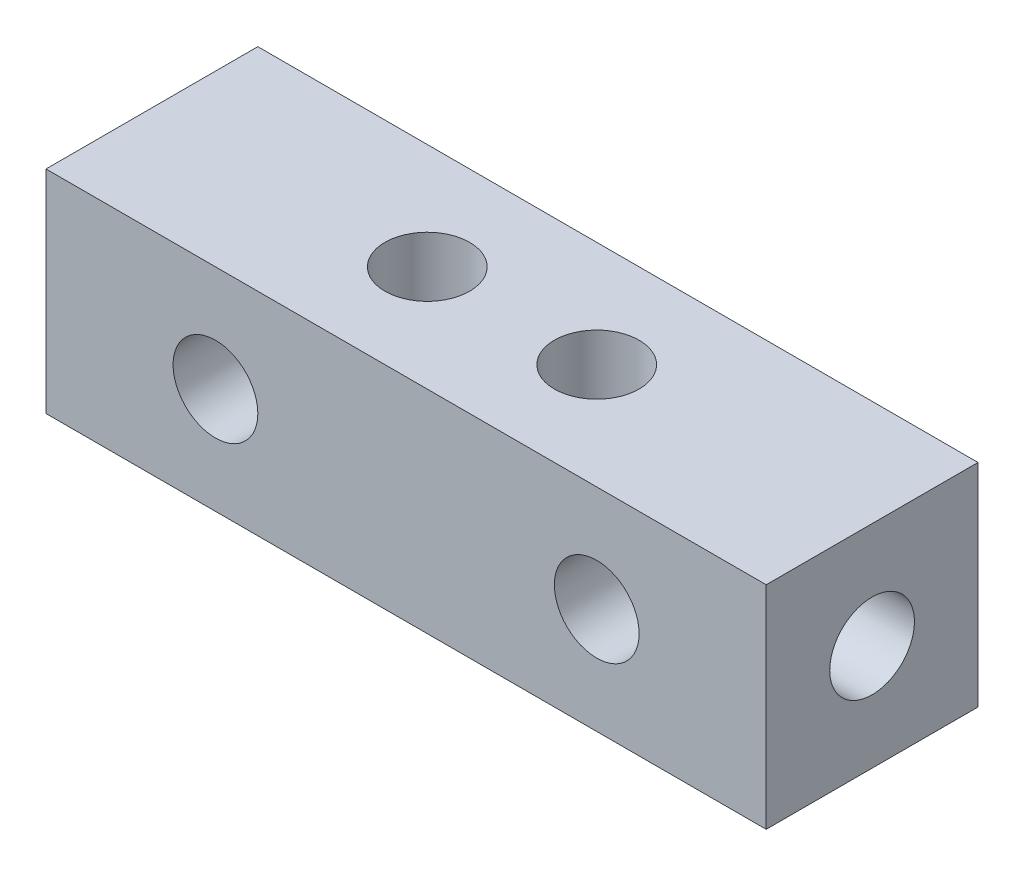
ISO-10303-21;
HEADER;
FILE_DESCRIPTION(('STEP AP214'),'2;1');
FILE_NAME('part.step','',(''),(''),'','','');
FILE_SCHEMA(('AUTOMOTIVE_DESIGN { 1 0 10303 214 1 1 1 1 }'));
ENDSEC;
DATA;
#1=APPLICATION_CONTEXT('core data for automotive mechanical design processes');
#2=APPLICATION_PROTOCOL_DEFINITION('international standard','automotive_design',2000,#1);
#3=PRODUCT_CONTEXT('',#1,'mechanical');
#4=PRODUCT('Part','Part','',(#3));
#5=PRODUCT_RELATED_PRODUCT_CATEGORY('part','',(#4));
#6=PRODUCT_DEFINITION_FORMATION('','',#4);
#7=PRODUCT_DEFINITION_CONTEXT('part definition',#1,'design');
#8=PRODUCT_DEFINITION('design','',#6,#7);
#9=PRODUCT_DEFINITION_SHAPE('','',#8);
#10=(LENGTH_UNIT() NAMED_UNIT(*) SI_UNIT(.MILLI.,.METRE.));
#11=(NAMED_UNIT(*) PLANE_ANGLE_UNIT() SI_UNIT($,.RADIAN.));
#12=(NAMED_UNIT(*) SI_UNIT($,.STERADIAN.) SOLID_ANGLE_UNIT());
#13=UNCERTAINTY_MEASURE_WITH_UNIT(LENGTH_MEASURE(1.E-05),#10,'distance_accuracy_value','');
#14=(GEOMETRIC_REPRESENTATION_CONTEXT(3) GLOBAL_UNCERTAINTY_ASSIGNED_CONTEXT((#13)) GLOBAL_UNIT_ASSIGNED_CONTEXT((#10,
#11,#12)) REPRESENTATION_CONTEXT('',''));
#15=CARTESIAN_POINT('',(0.,0.,0.));
#16=DIRECTION('',(0.,0.,1.));
#17=DIRECTION('',(1.,0.,0.));
#18=AXIS2_PLACEMENT_3D('',#15,#16,#17);
#19=CARTESIAN_POINT('',(9.,5.,-5.));
#20=DIRECTION('',(0.,0.,1.));
#21=DIRECTION('',(1.,0.,0.));
#22=AXIS2_PLACEMENT_3D('',#19,#20,#21);
#23=CYLINDRICAL_SURFACE('',#22,2.);
#24=CARTESIAN_POINT('',(9.,5.,5.));
#25=DIRECTION('',(0.,0.,1.));
#26=DIRECTION('',(1.,0.,0.));
#27=AXIS2_PLACEMENT_3D('',#24,#25,#26);
#28=CIRCLE('',#27,2.);
#29=CARTESIAN_POINT('',(11.,5.,5.));
#30=VERTEX_POINT('',#29);
#31=EDGE_CURVE('E213',#30,#30,#28,.T.);
#32=ORIENTED_EDGE('',*,*,#31,.T.);
#33=EDGE_LOOP('',(#32));
#34=FACE_BOUND('',#33,.T.);
#35=CARTESIAN_POINT('',(9.,5.,-5.));
#36=DIRECTION('',(0.,0.,1.));
#37=DIRECTION('',(1.,0.,0.));
#38=AXIS2_PLACEMENT_3D('',#35,#36,#37);
#39=CIRCLE('',#38,2.);
#40=CARTESIAN_POINT('',(11.,5.,-5.));
#41=VERTEX_POINT('',#40);
#42=EDGE_CURVE('E133',#41,#41,#39,.T.);
#43=ORIENTED_EDGE('',*,*,#42,.F.);
#44=EDGE_LOOP('',(#43));
#45=FACE_BOUND('',#44,.T.);
#46=CARTESIAN_POINT('',(9.,5.,0.));
#47=DIRECTION('',(0.707106781186548,0.,0.707106781186547));
#48=DIRECTION('',(-0.707106781186547,0.,0.707106781186548));
#49=AXIS2_PLACEMENT_3D('',#46,#47,#48);
#50=ELLIPSE('',#49,2.82842712474619,2.);
#51=CARTESIAN_POINT('',(8.99999999999999,7.,0.));
#52=VERTEX_POINT('',#51);
#53=CARTESIAN_POINT('',(8.99999999999999,3.,0.));
#54=VERTEX_POINT('',#53);
#55=EDGE_CURVE('E11',#52,#54,#50,.F.);
#56=ORIENTED_EDGE('',*,*,#55,.F.);
#57=CARTESIAN_POINT('',(9.,5.,0.));
#58=DIRECTION('',(-0.707106781186547,0.,0.707106781186548));
#59=DIRECTION('',(0.707106781186548,0.,0.707106781186547));
#60=AXIS2_PLACEMENT_3D('',#57,#58,#59);
#61=ELLIPSE('',#60,2.82842712474619,2.);
#62=EDGE_CURVE('E51',#54,#52,#61,.T.);
#63=ORIENTED_EDGE('',*,*,#62,.F.);
#64=EDGE_LOOP('',(#56,#63));
#65=FACE_BOUND('',#64,.T.);
#66=ADVANCED_FACE('F43',(#34,#45,#65),#23,.F.);
#67=CARTESIAN_POINT('',(17.,10.,-5.));
#68=DIRECTION('',(-1.,0.,0.));
#69=DIRECTION('',(0.,0.,1.));
#70=AXIS2_PLACEMENT_3D('',#67,#68,#69);
#71=PLANE('',#70);
#72=CARTESIAN_POINT('',(17.,5.,0.));
#73=DIRECTION('',(-1.,0.,0.));
#74=DIRECTION('',(0.,0.,1.));
#75=AXIS2_PLACEMENT_3D('',#72,#73,#74);
#76=CIRCLE('',#75,2.);
#77=CARTESIAN_POINT('',(17.,5.,1.99999999999999));
#78=VERTEX_POINT('',#77);
#79=EDGE_CURVE('E231',#78,#78,#76,.T.);
#80=ORIENTED_EDGE('',*,*,#79,.T.);
#81=EDGE_LOOP('',(#80));
#82=FACE_BOUND('',#81,.T.);
#83=DIRECTION('',(0.,0.,-1.));
#84=VECTOR('',#83,1.);
#85=CARTESIAN_POINT('',(17.,0.,-5.));
#86=LINE('',#85,#84);
#87=CARTESIAN_POINT('',(17.,0.,5.));
#88=VERTEX_POINT('',#87);
#89=CARTESIAN_POINT('',(17.,0.,-5.));
#90=VERTEX_POINT('',#89);
#91=EDGE_CURVE('E146',#88,#90,#86,.T.);
#92=ORIENTED_EDGE('',*,*,#91,.T.);
#93=DIRECTION('',(0.,-1.,0.));
#94=VECTOR('',#93,1.);
#95=CARTESIAN_POINT('',(17.,10.,-5.));
#96=LINE('',#95,#94);
#97=CARTESIAN_POINT('',(17.,10.,-5.));
#98=VERTEX_POINT('',#97);
#99=EDGE_CURVE('E142',#98,#90,#96,.T.);
#100=ORIENTED_EDGE('',*,*,#99,.F.);
#101=DIRECTION('',(0.,0.,-1.));
#102=VECTOR('',#101,1.);
#103=CARTESIAN_POINT('',(17.,10.,-5.));
#104=LINE('',#103,#102);
#105=CARTESIAN_POINT('',(17.,10.,5.));
#106=VERTEX_POINT('',#105);
#107=EDGE_CURVE('E157',#106,#98,#104,.T.);
#108=ORIENTED_EDGE('',*,*,#107,.F.);
#109=DIRECTION('',(0.,-1.,0.));
#110=VECTOR('',#109,1.);
#111=CARTESIAN_POINT('',(17.,10.,5.));
#112=LINE('',#111,#110);
#113=EDGE_CURVE('E162',#106,#88,#112,.T.);
#114=ORIENTED_EDGE('',*,*,#113,.T.);
#115=EDGE_LOOP('',(#92,#100,#108,#114));
#116=FACE_BOUND('',#115,.T.);
#117=ADVANCED_FACE('F44',(#82,#116),#71,.F.);
#118=CARTESIAN_POINT('',(-17.,10.,-5.));
#119=DIRECTION('',(0.,0.,1.));
#120=DIRECTION('',(1.,0.,0.));
#121=AXIS2_PLACEMENT_3D('',#118,#119,#120);
#122=PLANE('',#121);
#123=CARTESIAN_POINT('',(-9.,5.,-5.));
#124=DIRECTION('',(0.,0.,1.));
#125=DIRECTION('',(1.,0.,0.));
#126=AXIS2_PLACEMENT_3D('',#123,#124,#125);
#127=CIRCLE('',#126,2.);
#128=CARTESIAN_POINT('',(-7.,5.,-5.));
#129=VERTEX_POINT('',#128);
#130=EDGE_CURVE('E128',#129,#129,#127,.T.);
#131=ORIENTED_EDGE('',*,*,#130,.T.);
#132=EDGE_LOOP('',(#131));
#133=FACE_BOUND('',#132,.T.);
#134=ORIENTED_EDGE('',*,*,#42,.T.);
#135=EDGE_LOOP('',(#134));
#136=FACE_BOUND('',#135,.T.);
#137=DIRECTION('',(-1.,0.,0.));
#138=VECTOR('',#137,1.);
#139=CARTESIAN_POINT('',(-17.,0.,-5.));
#140=LINE('',#139,#138);
#141=CARTESIAN_POINT('',(-17.,0.,-5.));
#142=VERTEX_POINT('',#141);
#143=EDGE_CURVE('E140',#90,#142,#140,.T.);
#144=ORIENTED_EDGE('',*,*,#143,.T.);
#145=DIRECTION('',(0.,-1.,0.));
#146=VECTOR('',#145,1.);
#147=CARTESIAN_POINT('',(-17.,10.,-5.));
#148=LINE('',#147,#146);
#149=CARTESIAN_POINT('',(-17.,10.,-5.));
#150=VERTEX_POINT('',#149);
#151=EDGE_CURVE('E137',#150,#142,#148,.T.);
#152=ORIENTED_EDGE('',*,*,#151,.F.);
#153=DIRECTION('',(-1.,0.,0.));
#154=VECTOR('',#153,1.);
#155=CARTESIAN_POINT('',(-17.,10.,-5.));
#156=LINE('',#155,#154);
#157=EDGE_CURVE('E217',#98,#150,#156,.T.);
#158=ORIENTED_EDGE('',*,*,#157,.F.);
#159=ORIENTED_EDGE('',*,*,#99,.T.);
#160=EDGE_LOOP('',(#144,#152,#158,#159));
#161=FACE_BOUND('',#160,.T.);
#162=ADVANCED_FACE('F99',(#133,#136,#161),#122,.F.);
#163=CARTESIAN_POINT('',(-17.,10.,-5.));
#164=DIRECTION('',(1.,0.,0.));
#165=DIRECTION('',(0.,0.,-1.));
#166=AXIS2_PLACEMENT_3D('',#163,#164,#165);
#167=PLANE('',#166);
#168=CARTESIAN_POINT('',(-17.,5.,0.));
#169=DIRECTION('',(-1.,0.,0.));
#170=DIRECTION('',(0.,0.,1.));
#171=AXIS2_PLACEMENT_3D('',#168,#169,#170);
#172=CIRCLE('',#171,2.);
#173=CARTESIAN_POINT('',(-17.,5.,1.99999999999999));
#174=VERTEX_POINT('',#173);
#175=EDGE_CURVE('E202',#174,#174,#172,.T.);
#176=ORIENTED_EDGE('',*,*,#175,.F.);
#177=EDGE_LOOP('',(#176));
#178=FACE_BOUND('',#177,.T.);
#179=DIRECTION('',(0.,0.,1.));
#180=VECTOR('',#179,1.);
#181=CARTESIAN_POINT('',(-17.,0.,-5.));
#182=LINE('',#181,#180);
#183=CARTESIAN_POINT('',(-17.,0.,5.));
#184=VERTEX_POINT('',#183);
#185=EDGE_CURVE('E150',#142,#184,#182,.T.);
#186=ORIENTED_EDGE('',*,*,#185,.T.);
#187=DIRECTION('',(0.,-1.,0.));
#188=VECTOR('',#187,1.);
#189=CARTESIAN_POINT('',(-17.,10.,5.));
#190=LINE('',#189,#188);
#191=CARTESIAN_POINT('',(-17.,10.,5.));
#192=VERTEX_POINT('',#191);
#193=EDGE_CURVE('E152',#192,#184,#190,.T.);
#194=ORIENTED_EDGE('',*,*,#193,.F.);
#195=DIRECTION('',(0.,0.,1.));
#196=VECTOR('',#195,1.);
#197=CARTESIAN_POINT('',(-17.,10.,-5.));
#198=LINE('',#197,#196);
#199=EDGE_CURVE('E153',#150,#192,#198,.T.);
#200=ORIENTED_EDGE('',*,*,#199,.F.);
#201=ORIENTED_EDGE('',*,*,#151,.T.);
#202=EDGE_LOOP('',(#186,#194,#200,#201));
#203=FACE_BOUND('',#202,.T.);
#204=ADVANCED_FACE('F118',(#178,#203),#167,.F.);
#205=CARTESIAN_POINT('',(-17.,10.,5.));
#206=DIRECTION('',(0.,0.,-1.));
#207=DIRECTION('',(-1.,0.,0.));
#208=AXIS2_PLACEMENT_3D('',#205,#206,#207);
#209=PLANE('',#208);
#210=CARTESIAN_POINT('',(-9.,5.,5.));
#211=DIRECTION('',(0.,0.,1.));
#212=DIRECTION('',(1.,0.,0.));
#213=AXIS2_PLACEMENT_3D('',#210,#211,#212);
#214=CIRCLE('',#213,2.);
#215=CARTESIAN_POINT('',(-7.,5.,5.));
#216=VERTEX_POINT('',#215);
#217=EDGE_CURVE('E209',#216,#216,#214,.T.);
#218=ORIENTED_EDGE('',*,*,#217,.F.);
#219=EDGE_LOOP('',(#218));
#220=FACE_BOUND('',#219,.T.);
#221=ORIENTED_EDGE('',*,*,#31,.F.);
#222=EDGE_LOOP('',(#221));
#223=FACE_BOUND('',#222,.T.);
#224=DIRECTION('',(1.,0.,0.));
#225=VECTOR('',#224,1.);
#226=CARTESIAN_POINT('',(-17.,0.,5.));
#227=LINE('',#226,#225);
#228=EDGE_CURVE('E160',#184,#88,#227,.T.);
#229=ORIENTED_EDGE('',*,*,#228,.T.);
#230=ORIENTED_EDGE('',*,*,#113,.F.);
#231=DIRECTION('',(1.,0.,0.));
#232=VECTOR('',#231,1.);
#233=CARTESIAN_POINT('',(-17.,10.,5.));
#234=LINE('',#233,#232);
#235=EDGE_CURVE('E167',#192,#106,#234,.T.);
#236=ORIENTED_EDGE('',*,*,#235,.F.);
#237=ORIENTED_EDGE('',*,*,#193,.T.);
#238=EDGE_LOOP('',(#229,#230,#236,#237));
#239=FACE_BOUND('',#238,.T.);
#240=ADVANCED_FACE('F115',(#220,#223,#239),#209,.F.);
#241=CARTESIAN_POINT('',(0.,10.,0.));
#242=DIRECTION('',(0.,1.,0.));
#243=DIRECTION('',(0.,0.,1.));
#244=AXIS2_PLACEMENT_3D('',#241,#242,#243);
#245=PLANE('',#244);
#246=CARTESIAN_POINT('',(-4.,10.,0.));
#247=DIRECTION('',(0.,1.,0.));
#248=DIRECTION('',(0.,0.,1.));
#249=AXIS2_PLACEMENT_3D('',#246,#247,#248);
#250=CIRCLE('',#249,2.);
#251=CARTESIAN_POINT('',(-4.,10.,2.));
#252=VERTEX_POINT('',#251);
#253=EDGE_CURVE('E199',#252,#252,#250,.T.);
#254=ORIENTED_EDGE('',*,*,#253,.F.);
#255=EDGE_LOOP('',(#254));
#256=FACE_BOUND('',#255,.T.);
#257=CARTESIAN_POINT('',(4.,10.,0.));
#258=DIRECTION('',(0.,1.,0.));
#259=DIRECTION('',(0.,0.,1.));
#260=AXIS2_PLACEMENT_3D('',#257,#258,#259);
#261=CIRCLE('',#260,2.);
#262=CARTESIAN_POINT('',(4.,10.,2.));
#263=VERTEX_POINT('',#262);
#264=EDGE_CURVE('E196',#263,#263,#261,.T.);
#265=ORIENTED_EDGE('',*,*,#264,.F.);
#266=EDGE_LOOP('',(#265));
#267=FACE_BOUND('',#266,.T.);
#268=ORIENTED_EDGE('',*,*,#107,.T.);
#269=ORIENTED_EDGE('',*,*,#157,.T.);
#270=ORIENTED_EDGE('',*,*,#199,.T.);
#271=ORIENTED_EDGE('',*,*,#235,.T.);
#272=EDGE_LOOP('',(#268,#269,#270,#271));
#273=FACE_BOUND('',#272,.T.);
#274=ADVANCED_FACE('F107',(#256,#267,#273),#245,.T.);
#275=CARTESIAN_POINT('',(0.,0.,0.));
#276=DIRECTION('',(0.,1.,0.));
#277=DIRECTION('',(0.,0.,1.));
#278=AXIS2_PLACEMENT_3D('',#275,#276,#277);
#279=PLANE('',#278);
#280=CARTESIAN_POINT('',(-4.,0.,0.));
#281=DIRECTION('',(0.,1.,0.));
#282=DIRECTION('',(0.,0.,1.));
#283=AXIS2_PLACEMENT_3D('',#280,#281,#282);
#284=CIRCLE('',#283,2.);
#285=CARTESIAN_POINT('',(-4.,0.,2.));
#286=VERTEX_POINT('',#285);
#287=EDGE_CURVE('E201',#286,#286,#284,.T.);
#288=ORIENTED_EDGE('',*,*,#287,.T.);
#289=EDGE_LOOP('',(#288));
#290=FACE_BOUND('',#289,.T.);
#291=CARTESIAN_POINT('',(4.,0.,0.));
#292=DIRECTION('',(0.,1.,0.));
#293=DIRECTION('',(0.,0.,1.));
#294=AXIS2_PLACEMENT_3D('',#291,#292,#293);
#295=CIRCLE('',#294,2.);
#296=CARTESIAN_POINT('',(4.,0.,2.));
#297=VERTEX_POINT('',#296);
#298=EDGE_CURVE('E194',#297,#297,#295,.T.);
#299=ORIENTED_EDGE('',*,*,#298,.T.);
#300=EDGE_LOOP('',(#299));
#301=FACE_BOUND('',#300,.T.);
#302=ORIENTED_EDGE('',*,*,#91,.F.);
#303=ORIENTED_EDGE('',*,*,#228,.F.);
#304=ORIENTED_EDGE('',*,*,#185,.F.);
#305=ORIENTED_EDGE('',*,*,#143,.F.);
#306=EDGE_LOOP('',(#302,#303,#304,#305));
#307=FACE_BOUND('',#306,.T.);
#308=ADVANCED_FACE('F112',(#290,#301,#307),#279,.F.);
#309=CARTESIAN_POINT('',(-9.,5.,-5.));
#310=DIRECTION('',(0.,0.,1.));
#311=DIRECTION('',(1.,0.,0.));
#312=AXIS2_PLACEMENT_3D('',#309,#310,#311);
#313=CYLINDRICAL_SURFACE('',#312,2.);
#314=CARTESIAN_POINT('',(-9.,5.,0.));
#315=DIRECTION('',(0.707106781186547,0.,0.707106781186548));
#316=DIRECTION('',(-0.707106781186548,0.,0.707106781186547));
#317=AXIS2_PLACEMENT_3D('',#314,#315,#316);
#318=ELLIPSE('',#317,2.82842712474619,2.);
#319=CARTESIAN_POINT('',(-8.99999999999999,3.,0.));
#320=VERTEX_POINT('',#319);
#321=CARTESIAN_POINT('',(-8.99999999999999,7.,0.));
#322=VERTEX_POINT('',#321);
#323=EDGE_CURVE('E166',#320,#322,#318,.F.);
#324=ORIENTED_EDGE('',*,*,#323,.T.);
#325=CARTESIAN_POINT('',(-9.,5.,0.));
#326=DIRECTION('',(-0.707106781186548,0.,0.707106781186547));
#327=DIRECTION('',(0.707106781186547,0.,0.707106781186548));
#328=AXIS2_PLACEMENT_3D('',#325,#326,#327);
#329=ELLIPSE('',#328,2.82842712474619,2.);
#330=EDGE_CURVE('E62',#322,#320,#329,.T.);
#331=ORIENTED_EDGE('',*,*,#330,.T.);
#332=EDGE_LOOP('',(#324,#331));
#333=FACE_BOUND('',#332,.T.);
#334=ORIENTED_EDGE('',*,*,#130,.F.);
#335=EDGE_LOOP('',(#334));
#336=FACE_BOUND('',#335,.T.);
#337=ORIENTED_EDGE('',*,*,#217,.T.);
#338=EDGE_LOOP('',(#337));
#339=FACE_BOUND('',#338,.T.);
#340=ADVANCED_FACE('F106',(#333,#336,#339),#313,.F.);
#341=CARTESIAN_POINT('',(4.,0.,0.));
#342=DIRECTION('',(0.,1.,0.));
#343=DIRECTION('',(0.,0.,1.));
#344=AXIS2_PLACEMENT_3D('',#341,#342,#343);
#345=CYLINDRICAL_SURFACE('',#344,2.);
#346=ORIENTED_EDGE('',*,*,#298,.F.);
#347=EDGE_LOOP('',(#346));
#348=FACE_BOUND('',#347,.T.);
#349=ORIENTED_EDGE('',*,*,#264,.T.);
#350=EDGE_LOOP('',(#349));
#351=FACE_BOUND('',#350,.T.);
#352=ADVANCED_FACE('F184',(#348,#351),#345,.F.);
#353=CARTESIAN_POINT('',(-4.,0.,0.));
#354=DIRECTION('',(0.,1.,0.));
#355=DIRECTION('',(0.,0.,1.));
#356=AXIS2_PLACEMENT_3D('',#353,#354,#355);
#357=CYLINDRICAL_SURFACE('',#356,2.);
#358=ORIENTED_EDGE('',*,*,#287,.F.);
#359=EDGE_LOOP('',(#358));
#360=FACE_BOUND('',#359,.T.);
#361=ORIENTED_EDGE('',*,*,#253,.T.);
#362=EDGE_LOOP('',(#361));
#363=FACE_BOUND('',#362,.T.);
#364=ADVANCED_FACE('F173',(#360,#363),#357,.F.);
#365=CARTESIAN_POINT('',(-8.99999999999999,5.,0.));
#366=DIRECTION('',(-1.,0.,0.));
#367=DIRECTION('',(0.,0.,1.));
#368=AXIS2_PLACEMENT_3D('',#365,#366,#367);
#369=CYLINDRICAL_SURFACE('',#368,2.);
#370=ORIENTED_EDGE('',*,*,#175,.T.);
#371=EDGE_LOOP('',(#370));
#372=FACE_BOUND('',#371,.T.);
#373=ORIENTED_EDGE('',*,*,#323,.F.);
#374=ORIENTED_EDGE('',*,*,#330,.F.);
#375=EDGE_LOOP('',(#373,#374));
#376=FACE_BOUND('',#375,.T.);
#377=ADVANCED_FACE('F174',(#372,#376),#369,.F.);
#378=CARTESIAN_POINT('',(8.99999999999999,5.,0.));
#379=DIRECTION('',(1.,0.,0.));
#380=DIRECTION('',(0.,0.,-1.));
#381=AXIS2_PLACEMENT_3D('',#378,#379,#380);
#382=CYLINDRICAL_SURFACE('',#381,2.);
#383=ORIENTED_EDGE('',*,*,#79,.F.);
#384=EDGE_LOOP('',(#383));
#385=FACE_BOUND('',#384,.T.);
#386=ORIENTED_EDGE('',*,*,#55,.T.);
#387=ORIENTED_EDGE('',*,*,#62,.T.);
#388=EDGE_LOOP('',(#386,#387));
#389=FACE_BOUND('',#388,.T.);
#390=ADVANCED_FACE('F93',(#385,#389),#382,.F.);
#391=CLOSED_SHELL('',(#66,#117,#162,#204,#240,#274,#308,#340,#352,#364,#377,#390));
#392=MANIFOLD_SOLID_BREP('B2',#391);
#393=ADVANCED_BREP_SHAPE_REPRESENTATION('',(#18,#392),#14);
#394=SHAPE_DEFINITION_REPRESENTATION(#9,#393);
ENDSEC;
END-ISO-10303-21;
